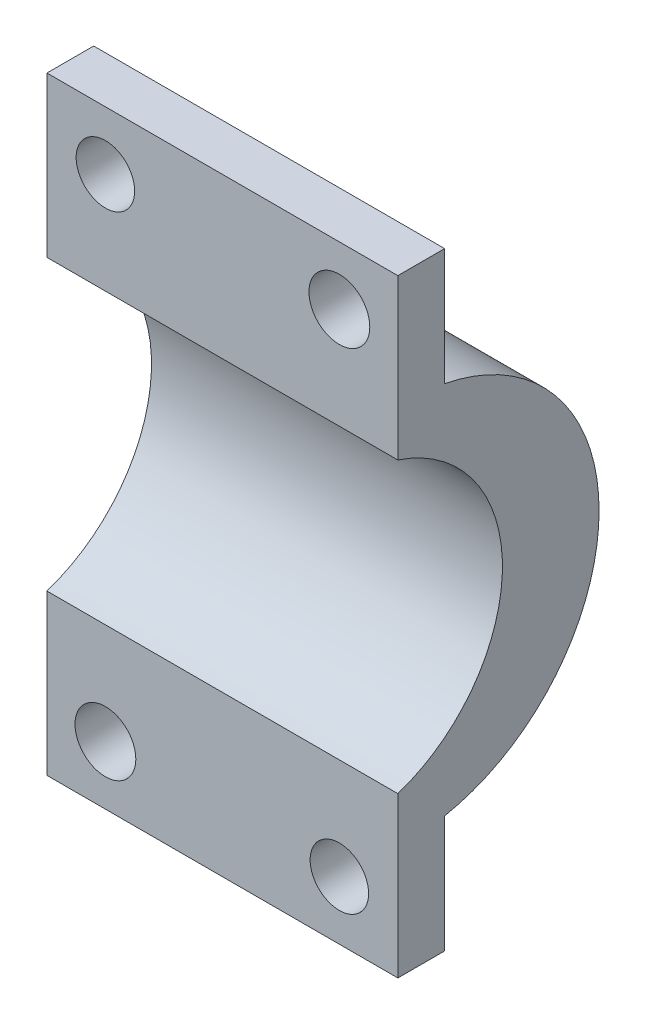
ISO-10303-21;
HEADER;
FILE_DESCRIPTION(('STEP AP214'),'2;1');
FILE_NAME('part.step','',(''),(''),'','','');
FILE_SCHEMA(('AUTOMOTIVE_DESIGN { 1 0 10303 214 1 1 1 1 }'));
ENDSEC;
DATA;
#1=APPLICATION_CONTEXT('core data for automotive mechanical design processes');
#2=APPLICATION_PROTOCOL_DEFINITION('international standard','automotive_design',2000,#1);
#3=PRODUCT_CONTEXT('',#1,'mechanical');
#4=PRODUCT('Part','Part','',(#3));
#5=PRODUCT_RELATED_PRODUCT_CATEGORY('part','',(#4));
#6=PRODUCT_DEFINITION_FORMATION('','',#4);
#7=PRODUCT_DEFINITION_CONTEXT('part definition',#1,'design');
#8=PRODUCT_DEFINITION('design','',#6,#7);
#9=PRODUCT_DEFINITION_SHAPE('','',#8);
#10=(LENGTH_UNIT() NAMED_UNIT(*) SI_UNIT(.MILLI.,.METRE.));
#11=(NAMED_UNIT(*) PLANE_ANGLE_UNIT() SI_UNIT($,.RADIAN.));
#12=(NAMED_UNIT(*) SI_UNIT($,.STERADIAN.) SOLID_ANGLE_UNIT());
#13=UNCERTAINTY_MEASURE_WITH_UNIT(LENGTH_MEASURE(1.E-05),#10,'distance_accuracy_value','');
#14=(GEOMETRIC_REPRESENTATION_CONTEXT(3) GLOBAL_UNCERTAINTY_ASSIGNED_CONTEXT((#13)) GLOBAL_UNIT_ASSIGNED_CONTEXT((#10,
#11,#12)) REPRESENTATION_CONTEXT('',''));
#15=CARTESIAN_POINT('',(0.,0.,0.));
#16=DIRECTION('',(0.,0.,1.));
#17=DIRECTION('',(1.,0.,0.));
#18=AXIS2_PLACEMENT_3D('',#15,#16,#17);
#19=CARTESIAN_POINT('',(0.,32.,6.99999999999999));
#20=DIRECTION('',(1.,0.,0.));
#21=DIRECTION('',(0.,0.,-1.));
#22=AXIS2_PLACEMENT_3D('',#19,#20,#21);
#23=PLANE('',#22);
#24=DIRECTION('',(0.,1.,0.));
#25=VECTOR('',#24,1.);
#26=CARTESIAN_POINT('',(0.,0.,13.940751301041));
#27=LINE('',#26,#25);
#28=CARTESIAN_POINT('',(0.,32.,13.940751301041));
#29=VERTEX_POINT('',#28);
#30=CARTESIAN_POINT('',(0.,42.,13.940751301041));
#31=VERTEX_POINT('',#30);
#32=EDGE_CURVE('E79',#29,#31,#27,.T.);
#33=ORIENTED_EDGE('',*,*,#32,.F.);
#34=CARTESIAN_POINT('',(0.,16.,17.033377074611));
#35=DIRECTION('',(1.,0.,0.));
#36=DIRECTION('',(0.,0.,-1.));
#37=AXIS2_PLACEMENT_3D('',#34,#35,#36);
#38=CIRCLE('',#37,16.2961447641873);
#39=CARTESIAN_POINT('',(0.,0.,13.940751301041));
#40=VERTEX_POINT('',#39);
#41=EDGE_CURVE('E182',#29,#40,#38,.F.);
#42=ORIENTED_EDGE('',*,*,#41,.T.);
#43=DIRECTION('',(0.,1.,0.));
#44=VECTOR('',#43,1.);
#45=CARTESIAN_POINT('',(0.,0.,13.940751301041));
#46=LINE('',#45,#44);
#47=CARTESIAN_POINT('',(0.,-10.,13.940751301041));
#48=VERTEX_POINT('',#47);
#49=EDGE_CURVE('E190',#48,#40,#46,.T.);
#50=ORIENTED_EDGE('',*,*,#49,.F.);
#51=DIRECTION('',(0.,0.,1.));
#52=VECTOR('',#51,1.);
#53=CARTESIAN_POINT('',(0.,-10.,13.940751301041));
#54=LINE('',#53,#52);
#55=CARTESIAN_POINT('',(0.,-10.,17.940751301041));
#56=VERTEX_POINT('',#55);
#57=EDGE_CURVE('E161',#48,#56,#54,.T.);
#58=ORIENTED_EDGE('',*,*,#57,.T.);
#59=DIRECTION('',(0.,1.,0.));
#60=VECTOR('',#59,1.);
#61=CARTESIAN_POINT('',(0.,3.65,17.940751301041));
#62=LINE('',#61,#60);
#63=CARTESIAN_POINT('',(0.,3.65,17.940751301041));
#64=VERTEX_POINT('',#63);
#65=EDGE_CURVE('E108',#56,#64,#62,.T.);
#66=ORIENTED_EDGE('',*,*,#65,.T.);
#67=CARTESIAN_POINT('',(0.,16.,22.));
#68=DIRECTION('',(1.,0.,0.));
#69=DIRECTION('',(0.,-1.,0.));
#70=AXIS2_PLACEMENT_3D('',#67,#68,#69);
#71=CIRCLE('',#70,13.);
#72=CARTESIAN_POINT('',(0.,28.35,17.940751301041));
#73=VERTEX_POINT('',#72);
#74=EDGE_CURVE('E95',#64,#73,#71,.T.);
#75=ORIENTED_EDGE('',*,*,#74,.T.);
#76=DIRECTION('',(0.,1.,0.));
#77=VECTOR('',#76,1.);
#78=CARTESIAN_POINT('',(0.,32.,17.940751301041));
#79=LINE('',#78,#77);
#80=CARTESIAN_POINT('',(0.,42.,17.940751301041));
#81=VERTEX_POINT('',#80);
#82=EDGE_CURVE('E90',#73,#81,#79,.T.);
#83=ORIENTED_EDGE('',*,*,#82,.T.);
#84=DIRECTION('',(0.,0.,1.));
#85=VECTOR('',#84,1.);
#86=CARTESIAN_POINT('',(0.,42.,13.940751301041));
#87=LINE('',#86,#85);
#88=EDGE_CURVE('E92',#31,#81,#87,.T.);
#89=ORIENTED_EDGE('',*,*,#88,.F.);
#90=EDGE_LOOP('',(#33,#42,#50,#58,#66,#75,#83,#89));
#91=FACE_BOUND('',#90,.T.);
#92=ADVANCED_FACE('F45',(#91),#23,.F.);
#93=CARTESIAN_POINT('',(30.,0.,6.99999999999999));
#94=DIRECTION('',(-1.,0.,0.));
#95=DIRECTION('',(0.,0.,1.));
#96=AXIS2_PLACEMENT_3D('',#93,#94,#95);
#97=PLANE('',#96);
#98=DIRECTION('',(0.,-1.,0.));
#99=VECTOR('',#98,1.);
#100=CARTESIAN_POINT('',(30.,0.,13.940751301041));
#101=LINE('',#100,#99);
#102=CARTESIAN_POINT('',(30.,0.,13.940751301041));
#103=VERTEX_POINT('',#102);
#104=CARTESIAN_POINT('',(30.,-10.,13.940751301041));
#105=VERTEX_POINT('',#104);
#106=EDGE_CURVE('E198',#103,#105,#101,.T.);
#107=ORIENTED_EDGE('',*,*,#106,.F.);
#108=CARTESIAN_POINT('',(30.,16.,17.033377074611));
#109=DIRECTION('',(-1.,0.,0.));
#110=DIRECTION('',(0.,0.,1.));
#111=AXIS2_PLACEMENT_3D('',#108,#109,#110);
#112=CIRCLE('',#111,16.2961447641873);
#113=CARTESIAN_POINT('',(30.,32.,13.940751301041));
#114=VERTEX_POINT('',#113);
#115=EDGE_CURVE('E208',#114,#103,#112,.T.);
#116=ORIENTED_EDGE('',*,*,#115,.F.);
#117=DIRECTION('',(0.,-1.,0.));
#118=VECTOR('',#117,1.);
#119=CARTESIAN_POINT('',(30.,0.,13.940751301041));
#120=LINE('',#119,#118);
#121=CARTESIAN_POINT('',(30.,42.,13.940751301041));
#122=VERTEX_POINT('',#121);
#123=EDGE_CURVE('E151',#122,#114,#120,.T.);
#124=ORIENTED_EDGE('',*,*,#123,.F.);
#125=DIRECTION('',(0.,0.,1.));
#126=VECTOR('',#125,1.);
#127=CARTESIAN_POINT('',(30.,42.,13.940751301041));
#128=LINE('',#127,#126);
#129=CARTESIAN_POINT('',(30.,42.,17.940751301041));
#130=VERTEX_POINT('',#129);
#131=EDGE_CURVE('E109',#122,#130,#128,.T.);
#132=ORIENTED_EDGE('',*,*,#131,.T.);
#133=DIRECTION('',(0.,1.,0.));
#134=VECTOR('',#133,1.);
#135=CARTESIAN_POINT('',(30.,32.,17.940751301041));
#136=LINE('',#135,#134);
#137=CARTESIAN_POINT('',(30.,28.35,17.940751301041));
#138=VERTEX_POINT('',#137);
#139=EDGE_CURVE('E113',#138,#130,#136,.T.);
#140=ORIENTED_EDGE('',*,*,#139,.F.);
#141=CARTESIAN_POINT('',(30.,16.,22.));
#142=DIRECTION('',(1.,0.,0.));
#143=DIRECTION('',(0.,-1.,0.));
#144=AXIS2_PLACEMENT_3D('',#141,#142,#143);
#145=CIRCLE('',#144,13.);
#146=CARTESIAN_POINT('',(30.,3.65,17.940751301041));
#147=VERTEX_POINT('',#146);
#148=EDGE_CURVE('E133',#147,#138,#145,.T.);
#149=ORIENTED_EDGE('',*,*,#148,.F.);
#150=DIRECTION('',(0.,1.,0.));
#151=VECTOR('',#150,1.);
#152=CARTESIAN_POINT('',(30.,3.65,17.940751301041));
#153=LINE('',#152,#151);
#154=CARTESIAN_POINT('',(30.,-10.,17.940751301041));
#155=VERTEX_POINT('',#154);
#156=EDGE_CURVE('E98',#155,#147,#153,.T.);
#157=ORIENTED_EDGE('',*,*,#156,.F.);
#158=DIRECTION('',(0.,0.,1.));
#159=VECTOR('',#158,1.);
#160=CARTESIAN_POINT('',(30.,-10.,13.940751301041));
#161=LINE('',#160,#159);
#162=EDGE_CURVE('E124',#105,#155,#161,.T.);
#163=ORIENTED_EDGE('',*,*,#162,.F.);
#164=EDGE_LOOP('',(#107,#116,#124,#132,#140,#149,#157,#163));
#165=FACE_BOUND('',#164,.T.);
#166=ADVANCED_FACE('F227',(#165),#97,.F.);
#167=CARTESIAN_POINT('',(30.,32.,17.940751301041));
#168=DIRECTION('',(0.,0.,1.));
#169=DIRECTION('',(1.,0.,0.));
#170=AXIS2_PLACEMENT_3D('',#167,#168,#169);
#171=PLANE('',#170);
#172=ORIENTED_EDGE('',*,*,#82,.F.);
#173=DIRECTION('',(-1.,0.,0.));
#174=VECTOR('',#173,1.);
#175=CARTESIAN_POINT('',(30.,28.35,17.940751301041));
#176=LINE('',#175,#174);
#177=EDGE_CURVE('E11',#138,#73,#176,.T.);
#178=ORIENTED_EDGE('',*,*,#177,.F.);
#179=ORIENTED_EDGE('',*,*,#139,.T.);
#180=DIRECTION('',(1.,0.,0.));
#181=VECTOR('',#180,1.);
#182=CARTESIAN_POINT('',(0.,42.,17.940751301041));
#183=LINE('',#182,#181);
#184=EDGE_CURVE('E104',#81,#130,#183,.T.);
#185=ORIENTED_EDGE('',*,*,#184,.F.);
#186=EDGE_LOOP('',(#172,#178,#179,#185));
#187=FACE_BOUND('',#186,.T.);
#188=CARTESIAN_POINT('',(25.,37.,17.940751301041));
#189=DIRECTION('',(0.,0.,1.));
#190=DIRECTION('',(1.,0.,0.));
#191=AXIS2_PLACEMENT_3D('',#188,#189,#190);
#192=CIRCLE('',#191,2.6);
#193=CARTESIAN_POINT('',(27.6,37.,17.940751301041));
#194=VERTEX_POINT('',#193);
#195=EDGE_CURVE('E116',#194,#194,#192,.F.);
#196=ORIENTED_EDGE('',*,*,#195,.T.);
#197=EDGE_LOOP('',(#196));
#198=FACE_BOUND('',#197,.T.);
#199=CARTESIAN_POINT('',(5.,37.,17.940751301041));
#200=DIRECTION('',(0.,0.,1.));
#201=DIRECTION('',(1.,0.,0.));
#202=AXIS2_PLACEMENT_3D('',#199,#200,#201);
#203=CIRCLE('',#202,2.5);
#204=CARTESIAN_POINT('',(7.5,37.,17.940751301041));
#205=VERTEX_POINT('',#204);
#206=EDGE_CURVE('E115',#205,#205,#203,.F.);
#207=ORIENTED_EDGE('',*,*,#206,.T.);
#208=EDGE_LOOP('',(#207));
#209=FACE_BOUND('',#208,.T.);
#210=ADVANCED_FACE('F111',(#187,#198,#209),#171,.T.);
#211=CARTESIAN_POINT('',(30.,16.,22.));
#212=DIRECTION('',(-1.,0.,0.));
#213=DIRECTION('',(0.,-1.,0.));
#214=AXIS2_PLACEMENT_3D('',#211,#212,#213);
#215=CYLINDRICAL_SURFACE('',#214,13.);
#216=ORIENTED_EDGE('',*,*,#74,.F.);
#217=DIRECTION('',(-1.,0.,0.));
#218=VECTOR('',#217,1.);
#219=CARTESIAN_POINT('',(30.,3.65,17.940751301041));
#220=LINE('',#219,#218);
#221=EDGE_CURVE('E48',#147,#64,#220,.T.);
#222=ORIENTED_EDGE('',*,*,#221,.F.);
#223=ORIENTED_EDGE('',*,*,#148,.T.);
#224=ORIENTED_EDGE('',*,*,#177,.T.);
#225=EDGE_LOOP('',(#216,#222,#223,#224));
#226=FACE_BOUND('',#225,.T.);
#227=ADVANCED_FACE('F270',(#226),#215,.F.);
#228=CARTESIAN_POINT('',(30.,3.65,17.940751301041));
#229=DIRECTION('',(0.,0.,1.));
#230=DIRECTION('',(1.,0.,0.));
#231=AXIS2_PLACEMENT_3D('',#228,#229,#230);
#232=PLANE('',#231);
#233=ORIENTED_EDGE('',*,*,#65,.F.);
#234=DIRECTION('',(-1.,0.,0.));
#235=VECTOR('',#234,1.);
#236=CARTESIAN_POINT('',(0.,-10.,17.940751301041));
#237=LINE('',#236,#235);
#238=EDGE_CURVE('E174',#155,#56,#237,.T.);
#239=ORIENTED_EDGE('',*,*,#238,.F.);
#240=ORIENTED_EDGE('',*,*,#156,.T.);
#241=ORIENTED_EDGE('',*,*,#221,.T.);
#242=EDGE_LOOP('',(#233,#239,#240,#241));
#243=FACE_BOUND('',#242,.T.);
#244=CARTESIAN_POINT('',(5.,-5.,17.940751301041));
#245=DIRECTION('',(0.,0.,1.));
#246=DIRECTION('',(1.,0.,0.));
#247=AXIS2_PLACEMENT_3D('',#244,#245,#246);
#248=CIRCLE('',#247,2.6);
#249=CARTESIAN_POINT('',(7.6,-5.,17.940751301041));
#250=VERTEX_POINT('',#249);
#251=EDGE_CURVE('E178',#250,#250,#248,.F.);
#252=ORIENTED_EDGE('',*,*,#251,.T.);
#253=EDGE_LOOP('',(#252));
#254=FACE_BOUND('',#253,.T.);
#255=CARTESIAN_POINT('',(25.,-5.,17.940751301041));
#256=DIRECTION('',(0.,0.,1.));
#257=DIRECTION('',(1.,0.,0.));
#258=AXIS2_PLACEMENT_3D('',#255,#256,#257);
#259=CIRCLE('',#258,2.5);
#260=CARTESIAN_POINT('',(27.5,-5.,17.940751301041));
#261=VERTEX_POINT('',#260);
#262=EDGE_CURVE('E169',#261,#261,#259,.F.);
#263=ORIENTED_EDGE('',*,*,#262,.T.);
#264=EDGE_LOOP('',(#263));
#265=FACE_BOUND('',#264,.T.);
#266=ADVANCED_FACE('F244',(#243,#254,#265),#232,.T.);
#267=CARTESIAN_POINT('',(0.,42.,13.940751301041));
#268=DIRECTION('',(0.,-1.,0.));
#269=DIRECTION('',(0.,0.,-1.));
#270=AXIS2_PLACEMENT_3D('',#267,#268,#269);
#271=PLANE('',#270);
#272=ORIENTED_EDGE('',*,*,#184,.T.);
#273=ORIENTED_EDGE('',*,*,#131,.F.);
#274=DIRECTION('',(1.,0.,0.));
#275=VECTOR('',#274,1.);
#276=CARTESIAN_POINT('',(0.,42.,13.940751301041));
#277=LINE('',#276,#275);
#278=EDGE_CURVE('E106',#31,#122,#277,.T.);
#279=ORIENTED_EDGE('',*,*,#278,.F.);
#280=ORIENTED_EDGE('',*,*,#88,.T.);
#281=EDGE_LOOP('',(#272,#273,#279,#280));
#282=FACE_BOUND('',#281,.T.);
#283=ADVANCED_FACE('F102',(#282),#271,.F.);
#284=CARTESIAN_POINT('',(25.,37.,13.940751301041));
#285=DIRECTION('',(0.,0.,1.));
#286=DIRECTION('',(1.,0.,0.));
#287=AXIS2_PLACEMENT_3D('',#284,#285,#286);
#288=CYLINDRICAL_SURFACE('',#287,2.6);
#289=CARTESIAN_POINT('',(25.,37.,13.940751301041));
#290=DIRECTION('',(0.,0.,1.));
#291=DIRECTION('',(1.,0.,0.));
#292=AXIS2_PLACEMENT_3D('',#289,#290,#291);
#293=CIRCLE('',#292,2.6);
#294=CARTESIAN_POINT('',(27.6,37.,13.940751301041));
#295=VERTEX_POINT('',#294);
#296=EDGE_CURVE('E121',#295,#295,#293,.F.);
#297=ORIENTED_EDGE('',*,*,#296,.T.);
#298=EDGE_LOOP('',(#297));
#299=FACE_BOUND('',#298,.T.);
#300=ORIENTED_EDGE('',*,*,#195,.F.);
#301=EDGE_LOOP('',(#300));
#302=FACE_BOUND('',#301,.T.);
#303=ADVANCED_FACE('F278',(#299,#302),#288,.F.);
#304=CARTESIAN_POINT('',(5.,37.,13.940751301041));
#305=DIRECTION('',(0.,0.,1.));
#306=DIRECTION('',(1.,0.,0.));
#307=AXIS2_PLACEMENT_3D('',#304,#305,#306);
#308=CYLINDRICAL_SURFACE('',#307,2.5);
#309=CARTESIAN_POINT('',(5.,37.,13.940751301041));
#310=DIRECTION('',(0.,0.,1.));
#311=DIRECTION('',(1.,0.,0.));
#312=AXIS2_PLACEMENT_3D('',#309,#310,#311);
#313=CIRCLE('',#312,2.5);
#314=CARTESIAN_POINT('',(7.5,37.,13.940751301041));
#315=VERTEX_POINT('',#314);
#316=EDGE_CURVE('E130',#315,#315,#313,.F.);
#317=ORIENTED_EDGE('',*,*,#316,.T.);
#318=EDGE_LOOP('',(#317));
#319=FACE_BOUND('',#318,.T.);
#320=ORIENTED_EDGE('',*,*,#206,.F.);
#321=EDGE_LOOP('',(#320));
#322=FACE_BOUND('',#321,.T.);
#323=ADVANCED_FACE('F259',(#319,#322),#308,.F.);
#324=CARTESIAN_POINT('',(0.,0.,13.940751301041));
#325=DIRECTION('',(0.,0.,1.));
#326=DIRECTION('',(1.,0.,0.));
#327=AXIS2_PLACEMENT_3D('',#324,#325,#326);
#328=PLANE('',#327);
#329=ORIENTED_EDGE('',*,*,#296,.F.);
#330=EDGE_LOOP('',(#329));
#331=FACE_BOUND('',#330,.T.);
#332=ORIENTED_EDGE('',*,*,#123,.T.);
#333=DIRECTION('',(-1.,0.,0.));
#334=VECTOR('',#333,1.);
#335=CARTESIAN_POINT('',(0.,32.,13.940751301041));
#336=LINE('',#335,#334);
#337=EDGE_CURVE('E145',#114,#29,#336,.T.);
#338=ORIENTED_EDGE('',*,*,#337,.T.);
#339=ORIENTED_EDGE('',*,*,#32,.T.);
#340=ORIENTED_EDGE('',*,*,#278,.T.);
#341=EDGE_LOOP('',(#332,#338,#339,#340));
#342=FACE_BOUND('',#341,.T.);
#343=ORIENTED_EDGE('',*,*,#316,.F.);
#344=EDGE_LOOP('',(#343));
#345=FACE_BOUND('',#344,.T.);
#346=ADVANCED_FACE('F250',(#331,#342,#345),#328,.F.);
#347=CARTESIAN_POINT('',(0.,-10.,13.940751301041));
#348=DIRECTION('',(0.,1.,0.));
#349=DIRECTION('',(0.,0.,1.));
#350=AXIS2_PLACEMENT_3D('',#347,#348,#349);
#351=PLANE('',#350);
#352=ORIENTED_EDGE('',*,*,#238,.T.);
#353=ORIENTED_EDGE('',*,*,#57,.F.);
#354=DIRECTION('',(-1.,0.,0.));
#355=VECTOR('',#354,1.);
#356=CARTESIAN_POINT('',(0.,-10.,13.940751301041));
#357=LINE('',#356,#355);
#358=EDGE_CURVE('E186',#105,#48,#357,.T.);
#359=ORIENTED_EDGE('',*,*,#358,.F.);
#360=ORIENTED_EDGE('',*,*,#162,.T.);
#361=EDGE_LOOP('',(#352,#353,#359,#360));
#362=FACE_BOUND('',#361,.T.);
#363=ADVANCED_FACE('F247',(#362),#351,.F.);
#364=CARTESIAN_POINT('',(5.,-5.,13.940751301041));
#365=DIRECTION('',(0.,0.,1.));
#366=DIRECTION('',(1.,0.,0.));
#367=AXIS2_PLACEMENT_3D('',#364,#365,#366);
#368=CYLINDRICAL_SURFACE('',#367,2.6);
#369=CARTESIAN_POINT('',(5.,-5.,13.940751301041));
#370=DIRECTION('',(0.,0.,1.));
#371=DIRECTION('',(1.,0.,0.));
#372=AXIS2_PLACEMENT_3D('',#369,#370,#371);
#373=CIRCLE('',#372,2.6);
#374=CARTESIAN_POINT('',(7.6,-5.,13.940751301041));
#375=VERTEX_POINT('',#374);
#376=EDGE_CURVE('E173',#375,#375,#373,.F.);
#377=ORIENTED_EDGE('',*,*,#376,.T.);
#378=EDGE_LOOP('',(#377));
#379=FACE_BOUND('',#378,.T.);
#380=ORIENTED_EDGE('',*,*,#251,.F.);
#381=EDGE_LOOP('',(#380));
#382=FACE_BOUND('',#381,.T.);
#383=ADVANCED_FACE('F249',(#379,#382),#368,.F.);
#384=CARTESIAN_POINT('',(25.,-5.,13.940751301041));
#385=DIRECTION('',(0.,0.,1.));
#386=DIRECTION('',(1.,0.,0.));
#387=AXIS2_PLACEMENT_3D('',#384,#385,#386);
#388=CYLINDRICAL_SURFACE('',#387,2.5);
#389=CARTESIAN_POINT('',(25.,-5.,13.940751301041));
#390=DIRECTION('',(0.,0.,1.));
#391=DIRECTION('',(1.,0.,0.));
#392=AXIS2_PLACEMENT_3D('',#389,#390,#391);
#393=CIRCLE('',#392,2.5);
#394=CARTESIAN_POINT('',(27.5,-5.,13.940751301041));
#395=VERTEX_POINT('',#394);
#396=EDGE_CURVE('E165',#395,#395,#393,.F.);
#397=ORIENTED_EDGE('',*,*,#396,.T.);
#398=EDGE_LOOP('',(#397));
#399=FACE_BOUND('',#398,.T.);
#400=ORIENTED_EDGE('',*,*,#262,.F.);
#401=EDGE_LOOP('',(#400));
#402=FACE_BOUND('',#401,.T.);
#403=ADVANCED_FACE('F256',(#399,#402),#388,.F.);
#404=CARTESIAN_POINT('',(0.,0.,13.940751301041));
#405=DIRECTION('',(0.,0.,1.));
#406=DIRECTION('',(1.,0.,0.));
#407=AXIS2_PLACEMENT_3D('',#404,#405,#406);
#408=PLANE('',#407);
#409=ORIENTED_EDGE('',*,*,#376,.F.);
#410=EDGE_LOOP('',(#409));
#411=FACE_BOUND('',#410,.T.);
#412=ORIENTED_EDGE('',*,*,#106,.T.);
#413=ORIENTED_EDGE('',*,*,#358,.T.);
#414=ORIENTED_EDGE('',*,*,#49,.T.);
#415=DIRECTION('',(-1.,0.,0.));
#416=VECTOR('',#415,1.);
#417=CARTESIAN_POINT('',(0.,0.,13.940751301041));
#418=LINE('',#417,#416);
#419=EDGE_CURVE('E194',#103,#40,#418,.T.);
#420=ORIENTED_EDGE('',*,*,#419,.F.);
#421=EDGE_LOOP('',(#412,#413,#414,#420));
#422=FACE_BOUND('',#421,.T.);
#423=ORIENTED_EDGE('',*,*,#396,.F.);
#424=EDGE_LOOP('',(#423));
#425=FACE_BOUND('',#424,.T.);
#426=ADVANCED_FACE('F230',(#411,#422,#425),#408,.F.);
#427=CARTESIAN_POINT('',(-30.,16.,17.033377074611));
#428=DIRECTION('',(1.,0.,0.));
#429=DIRECTION('',(0.,0.,-1.));
#430=AXIS2_PLACEMENT_3D('',#427,#428,#429);
#431=CYLINDRICAL_SURFACE('',#430,16.2961447641873);
#432=ORIENTED_EDGE('',*,*,#337,.F.);
#433=ORIENTED_EDGE('',*,*,#115,.T.);
#434=ORIENTED_EDGE('',*,*,#419,.T.);
#435=ORIENTED_EDGE('',*,*,#41,.F.);
#436=EDGE_LOOP('',(#432,#433,#434,#435));
#437=FACE_BOUND('',#436,.T.);
#438=ADVANCED_FACE('F216',(#437),#431,.T.);
#439=CLOSED_SHELL('',(#92,#166,#210,#227,#266,#283,#303,#323,#346,#363,#383,#403,#426,#438));
#440=MANIFOLD_SOLID_BREP('B2',#439);
#441=ADVANCED_BREP_SHAPE_REPRESENTATION('',(#18,#440),#14);
#442=SHAPE_DEFINITION_REPRESENTATION(#9,#441);
ENDSEC;
END-ISO-10303-21;
